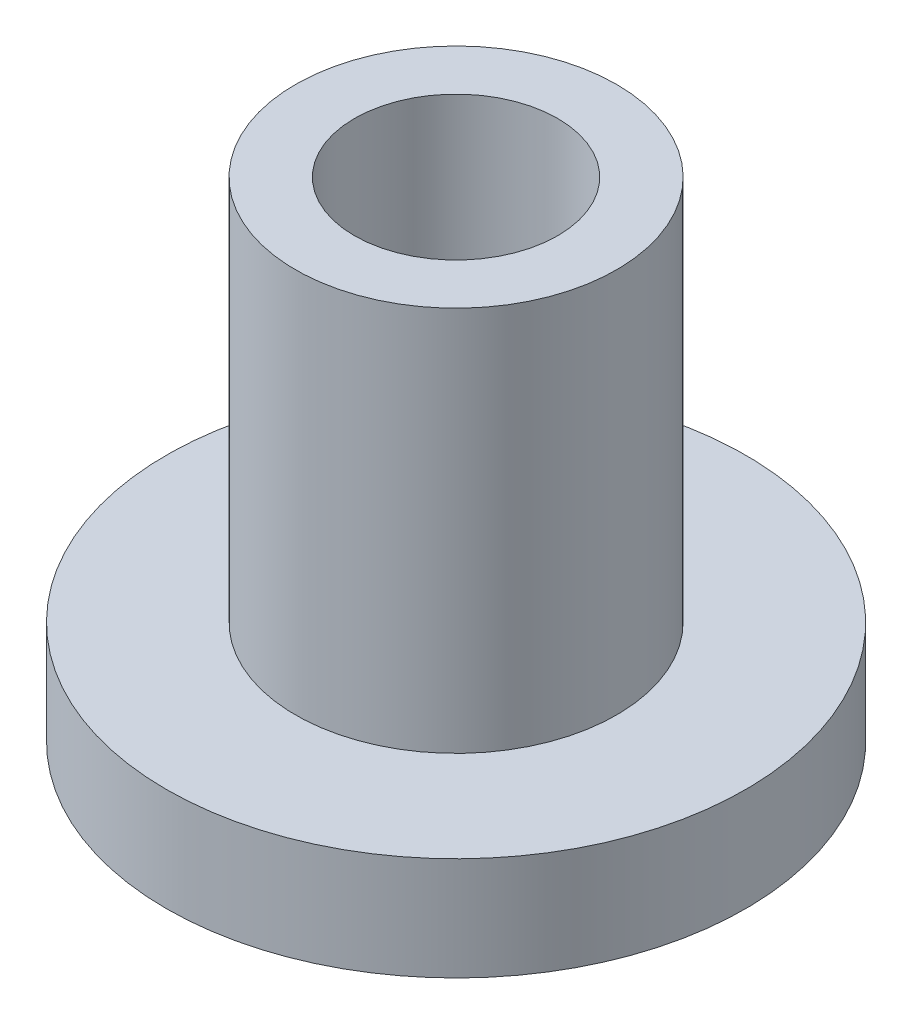
ISO-10303-21;
HEADER;
FILE_DESCRIPTION(('STEP AP214'),'2;1');
FILE_NAME('part.step','',(''),(''),'','','');
FILE_SCHEMA(('AUTOMOTIVE_DESIGN { 1 0 10303 214 1 1 1 1 }'));
ENDSEC;
DATA;
#1=APPLICATION_CONTEXT('core data for automotive mechanical design processes');
#2=APPLICATION_PROTOCOL_DEFINITION('international standard','automotive_design',2000,#1);
#3=PRODUCT_CONTEXT('',#1,'mechanical');
#4=PRODUCT('Part','Part','',(#3));
#5=PRODUCT_RELATED_PRODUCT_CATEGORY('part','',(#4));
#6=PRODUCT_DEFINITION_FORMATION('','',#4);
#7=PRODUCT_DEFINITION_CONTEXT('part definition',#1,'design');
#8=PRODUCT_DEFINITION('design','',#6,#7);
#9=PRODUCT_DEFINITION_SHAPE('','',#8);
#10=(LENGTH_UNIT() NAMED_UNIT(*) SI_UNIT(.MILLI.,.METRE.));
#11=(NAMED_UNIT(*) PLANE_ANGLE_UNIT() SI_UNIT($,.RADIAN.));
#12=(NAMED_UNIT(*) SI_UNIT($,.STERADIAN.) SOLID_ANGLE_UNIT());
#13=UNCERTAINTY_MEASURE_WITH_UNIT(LENGTH_MEASURE(1.E-05),#10,'distance_accuracy_value','');
#14=(GEOMETRIC_REPRESENTATION_CONTEXT(3) GLOBAL_UNCERTAINTY_ASSIGNED_CONTEXT((#13)) GLOBAL_UNIT_ASSIGNED_CONTEXT((#10,
#11,#12)) REPRESENTATION_CONTEXT('',''));
#15=CARTESIAN_POINT('',(0.,0.,0.));
#16=DIRECTION('',(0.,0.,1.));
#17=DIRECTION('',(1.,0.,0.));
#18=AXIS2_PLACEMENT_3D('',#15,#16,#17);
#19=CARTESIAN_POINT('',(0.,5.08,0.));
#20=DIRECTION('',(0.,1.,0.));
#21=DIRECTION('',(0.,0.,1.));
#22=AXIS2_PLACEMENT_3D('',#19,#20,#21);
#23=PLANE('',#22);
#24=CARTESIAN_POINT('',(0.,5.08,0.));
#25=DIRECTION('',(0.,1.,0.));
#26=DIRECTION('',(0.,0.,1.));
#27=AXIS2_PLACEMENT_3D('',#24,#25,#26);
#28=CIRCLE('',#27,14.25);
#29=CARTESIAN_POINT('',(0.,5.08,14.25));
#30=VERTEX_POINT('',#29);
#31=EDGE_CURVE('E48',#30,#30,#28,.T.);
#32=ORIENTED_EDGE('',*,*,#31,.T.);
#33=EDGE_LOOP('',(#32));
#34=FACE_BOUND('',#33,.T.);
#35=CARTESIAN_POINT('',(0.,5.08,0.));
#36=DIRECTION('',(0.,1.,0.));
#37=DIRECTION('',(0.,0.,1.));
#38=AXIS2_PLACEMENT_3D('',#35,#36,#37);
#39=CIRCLE('',#38,7.9);
#40=CARTESIAN_POINT('',(0.,5.08,-7.9));
#41=VERTEX_POINT('',#40);
#42=EDGE_CURVE('E44',#41,#41,#39,.T.);
#43=ORIENTED_EDGE('',*,*,#42,.F.);
#44=EDGE_LOOP('',(#43));
#45=FACE_BOUND('',#44,.T.);
#46=ADVANCED_FACE('F33',(#34,#45),#23,.T.);
#47=CARTESIAN_POINT('',(0.,5.08,0.));
#48=DIRECTION('',(0.,-1.,0.));
#49=DIRECTION('',(0.,0.,-1.));
#50=AXIS2_PLACEMENT_3D('',#47,#48,#49);
#51=CYLINDRICAL_SURFACE('',#50,14.25);
#52=ORIENTED_EDGE('',*,*,#31,.F.);
#53=EDGE_LOOP('',(#52));
#54=FACE_BOUND('',#53,.T.);
#55=CARTESIAN_POINT('',(0.,0.,0.));
#56=DIRECTION('',(0.,1.,0.));
#57=DIRECTION('',(0.,0.,1.));
#58=AXIS2_PLACEMENT_3D('',#55,#56,#57);
#59=CIRCLE('',#58,14.25);
#60=CARTESIAN_POINT('',(0.,0.,14.25));
#61=VERTEX_POINT('',#60);
#62=EDGE_CURVE('E51',#61,#61,#59,.T.);
#63=ORIENTED_EDGE('',*,*,#62,.T.);
#64=EDGE_LOOP('',(#63));
#65=FACE_BOUND('',#64,.T.);
#66=ADVANCED_FACE('F65',(#54,#65),#51,.T.);
#67=CARTESIAN_POINT('',(0.,0.,0.));
#68=DIRECTION('',(0.,1.,0.));
#69=DIRECTION('',(0.,0.,1.));
#70=AXIS2_PLACEMENT_3D('',#67,#68,#69);
#71=PLANE('',#70);
#72=CARTESIAN_POINT('',(0.,0.,0.));
#73=DIRECTION('',(0.,1.,0.));
#74=DIRECTION('',(0.,0.,1.));
#75=AXIS2_PLACEMENT_3D('',#72,#73,#74);
#76=CIRCLE('',#75,5.);
#77=CARTESIAN_POINT('',(0.,0.,5.));
#78=VERTEX_POINT('',#77);
#79=EDGE_CURVE('E54',#78,#78,#76,.F.);
#80=ORIENTED_EDGE('',*,*,#79,.F.);
#81=EDGE_LOOP('',(#80));
#82=FACE_BOUND('',#81,.T.);
#83=ORIENTED_EDGE('',*,*,#62,.F.);
#84=EDGE_LOOP('',(#83));
#85=FACE_BOUND('',#84,.T.);
#86=ADVANCED_FACE('F62',(#82,#85),#71,.F.);
#87=CARTESIAN_POINT('',(0.,24.05,0.));
#88=DIRECTION('',(0.,-1.,0.));
#89=DIRECTION('',(0.,0.,-1.));
#90=AXIS2_PLACEMENT_3D('',#87,#88,#89);
#91=CYLINDRICAL_SURFACE('',#90,7.9);
#92=CARTESIAN_POINT('',(0.,24.05,0.));
#93=DIRECTION('',(0.,1.,0.));
#94=DIRECTION('',(0.,0.,1.));
#95=AXIS2_PLACEMENT_3D('',#92,#93,#94);
#96=CIRCLE('',#95,7.9);
#97=CARTESIAN_POINT('',(0.,24.05,-7.9));
#98=VERTEX_POINT('',#97);
#99=EDGE_CURVE('E10',#98,#98,#96,.T.);
#100=CARTESIAN_POINT('',(0.,5.08,-7.9));
#101=CARTESIAN_POINT('',(0.,5.27760416666666,-7.9));
#102=CARTESIAN_POINT('',(0.,5.47520833333333,-7.9));
#103=CARTESIAN_POINT('',(0.,5.87041666666667,-7.9));
#104=CARTESIAN_POINT('',(0.,6.06802083333333,-7.9));
#105=CARTESIAN_POINT('',(0.,6.46322916666666,-7.9));
#106=CARTESIAN_POINT('',(0.,6.66083333333333,-7.9));
#107=CARTESIAN_POINT('',(0.,7.05604166666667,-7.9));
#108=CARTESIAN_POINT('',(0.,7.25364583333333,-7.9));
#109=CARTESIAN_POINT('',(0.,7.64885416666667,-7.9));
#110=CARTESIAN_POINT('',(0.,7.84645833333333,-7.9));
#111=CARTESIAN_POINT('',(0.,8.24166666666667,-7.9));
#112=CARTESIAN_POINT('',(0.,8.43927083333333,-7.9));
#113=CARTESIAN_POINT('',(0.,8.83447916666666,-7.9));
#114=CARTESIAN_POINT('',(0.,9.03208333333333,-7.9));
#115=CARTESIAN_POINT('',(0.,9.42729166666666,-7.9));
#116=CARTESIAN_POINT('',(0.,9.62489583333333,-7.9));
#117=CARTESIAN_POINT('',(0.,10.0201041666667,-7.9));
#118=CARTESIAN_POINT('',(0.,10.2177083333333,-7.9));
#119=CARTESIAN_POINT('',(0.,10.6129166666667,-7.9));
#120=CARTESIAN_POINT('',(0.,10.8105208333333,-7.9));
#121=CARTESIAN_POINT('',(0.,11.2057291666667,-7.9));
#122=CARTESIAN_POINT('',(0.,11.4033333333333,-7.9));
#123=CARTESIAN_POINT('',(0.,11.7985416666667,-7.9));
#124=CARTESIAN_POINT('',(0.,11.9961458333333,-7.9));
#125=CARTESIAN_POINT('',(0.,12.3913541666667,-7.9));
#126=CARTESIAN_POINT('',(0.,12.5889583333333,-7.9));
#127=CARTESIAN_POINT('',(0.,12.9841666666667,-7.9));
#128=CARTESIAN_POINT('',(0.,13.1817708333333,-7.9));
#129=CARTESIAN_POINT('',(0.,13.5769791666667,-7.9));
#130=CARTESIAN_POINT('',(0.,13.7745833333333,-7.9));
#131=CARTESIAN_POINT('',(0.,14.1697916666667,-7.9));
#132=CARTESIAN_POINT('',(0.,14.3673958333333,-7.9));
#133=CARTESIAN_POINT('',(0.,14.7626041666667,-7.9));
#134=CARTESIAN_POINT('',(0.,14.9602083333333,-7.9));
#135=CARTESIAN_POINT('',(0.,15.3554166666667,-7.9));
#136=CARTESIAN_POINT('',(0.,15.5530208333333,-7.9));
#137=CARTESIAN_POINT('',(0.,15.9482291666667,-7.9));
#138=CARTESIAN_POINT('',(0.,16.1458333333333,-7.9));
#139=CARTESIAN_POINT('',(0.,16.5410416666667,-7.9));
#140=CARTESIAN_POINT('',(0.,16.7386458333333,-7.9));
#141=CARTESIAN_POINT('',(0.,17.1338541666667,-7.9));
#142=CARTESIAN_POINT('',(0.,17.3314583333333,-7.9));
#143=CARTESIAN_POINT('',(0.,17.7266666666667,-7.9));
#144=CARTESIAN_POINT('',(0.,17.9242708333333,-7.9));
#145=CARTESIAN_POINT('',(0.,18.3194791666667,-7.9));
#146=CARTESIAN_POINT('',(0.,18.5170833333333,-7.9));
#147=CARTESIAN_POINT('',(0.,18.9122916666667,-7.9));
#148=CARTESIAN_POINT('',(0.,19.1098958333333,-7.9));
#149=CARTESIAN_POINT('',(0.,19.5051041666667,-7.9));
#150=CARTESIAN_POINT('',(0.,19.7027083333333,-7.9));
#151=CARTESIAN_POINT('',(0.,20.0979166666667,-7.9));
#152=CARTESIAN_POINT('',(0.,20.2955208333333,-7.9));
#153=CARTESIAN_POINT('',(0.,20.6907291666667,-7.9));
#154=CARTESIAN_POINT('',(0.,20.8883333333333,-7.9));
#155=CARTESIAN_POINT('',(0.,21.2835416666667,-7.9));
#156=CARTESIAN_POINT('',(0.,21.4811458333333,-7.9));
#157=CARTESIAN_POINT('',(0.,21.8763541666667,-7.9));
#158=CARTESIAN_POINT('',(0.,22.0739583333333,-7.9));
#159=CARTESIAN_POINT('',(0.,22.4691666666667,-7.9));
#160=CARTESIAN_POINT('',(0.,22.6667708333333,-7.9));
#161=CARTESIAN_POINT('',(0.,23.0619791666667,-7.9));
#162=CARTESIAN_POINT('',(0.,23.2595833333333,-7.9));
#163=CARTESIAN_POINT('',(0.,23.6547916666667,-7.9));
#164=CARTESIAN_POINT('',(0.,23.8523958333333,-7.9));
#165=CARTESIAN_POINT('',(0.,24.05,-7.9));
#166=B_SPLINE_CURVE_WITH_KNOTS('',3,(#100,#101,#102,#103,#104,#105,#106,#107,#108,#109,#110,
#111,#112,#113,#114,#115,#116,#117,#118,#119,#120,#121,#122,#123,#124,#125,#126,#127,#128,#129,
#130,#131,#132,#133,#134,#135,#136,#137,#138,#139,#140,#141,#142,#143,#144,#145,#146,#147,#148,
#149,#150,#151,#152,#153,#154,#155,#156,#157,#158,#159,#160,#161,#162,#163,#164,#165),
.UNSPECIFIED.,.F.,.F.,(4,2,2,2,2,2,2,2,2,2,2,2,2,2,2,2,2,2,2,2,2,2,2,2,2,2,2,2,2,2,2,2,4),(0.,
0.592812500000001,1.185625,1.7784375,2.37125,2.9640625,3.556875,4.1496875,4.7425,5.3353125,
5.928125,6.5209375,7.11375,7.7065625,8.299375,8.8921875,9.485,10.0778125,10.670625,11.2634375,
11.85625,12.4490625,13.041875,13.6346875,14.2275,14.8203125,15.413125,16.0059375,16.59875,
17.1915625,17.784375,18.3771875,18.97),.UNSPECIFIED.);
#167=EDGE_CURVE('BSEAM35',#41,#98,#166,.T.);
#168=ORIENTED_EDGE('',*,*,#42,.T.);
#169=ORIENTED_EDGE('',*,*,#99,.F.);
#170=ORIENTED_EDGE('',*,*,#167,.T.);
#171=ORIENTED_EDGE('',*,*,#167,.F.);
#172=EDGE_LOOP('',(#168,#170,#169,#171));
#173=FACE_BOUND('',#172,.T.);
#174=ADVANCED_FACE('F35',(#173),#91,.T.);
#175=CARTESIAN_POINT('',(0.,24.05,0.));
#176=DIRECTION('',(0.,1.,0.));
#177=DIRECTION('',(0.,0.,1.));
#178=AXIS2_PLACEMENT_3D('',#175,#176,#177);
#179=PLANE('',#178);
#180=CARTESIAN_POINT('',(0.,24.05,0.));
#181=DIRECTION('',(0.,1.,0.));
#182=DIRECTION('',(0.,0.,1.));
#183=AXIS2_PLACEMENT_3D('',#180,#181,#182);
#184=CIRCLE('',#183,5.);
#185=CARTESIAN_POINT('',(0.,24.05,5.));
#186=VERTEX_POINT('',#185);
#187=EDGE_CURVE('E40',#186,#186,#184,.T.);
#188=ORIENTED_EDGE('',*,*,#187,.F.);
#189=EDGE_LOOP('',(#188));
#190=FACE_BOUND('',#189,.T.);
#191=ORIENTED_EDGE('',*,*,#99,.T.);
#192=EDGE_LOOP('',(#191));
#193=FACE_BOUND('',#192,.T.);
#194=ADVANCED_FACE('F80',(#190,#193),#179,.T.);
#195=CARTESIAN_POINT('',(0.,4.999,0.));
#196=DIRECTION('',(0.,1.,0.));
#197=DIRECTION('',(0.,0.,1.));
#198=AXIS2_PLACEMENT_3D('',#195,#196,#197);
#199=CYLINDRICAL_SURFACE('',#198,5.);
#200=ORIENTED_EDGE('',*,*,#187,.T.);
#201=EDGE_LOOP('',(#200));
#202=FACE_BOUND('',#201,.T.);
#203=ORIENTED_EDGE('',*,*,#79,.T.);
#204=EDGE_LOOP('',(#203));
#205=FACE_BOUND('',#204,.T.);
#206=ADVANCED_FACE('F60',(#202,#205),#199,.F.);
#207=CLOSED_SHELL('',(#46,#66,#86,#174,#194,#206));
#208=MANIFOLD_SOLID_BREP('B2',#207);
#209=ADVANCED_BREP_SHAPE_REPRESENTATION('',(#18,#208),#14);
#210=SHAPE_DEFINITION_REPRESENTATION(#9,#209);
ENDSEC;
END-ISO-10303-21;
